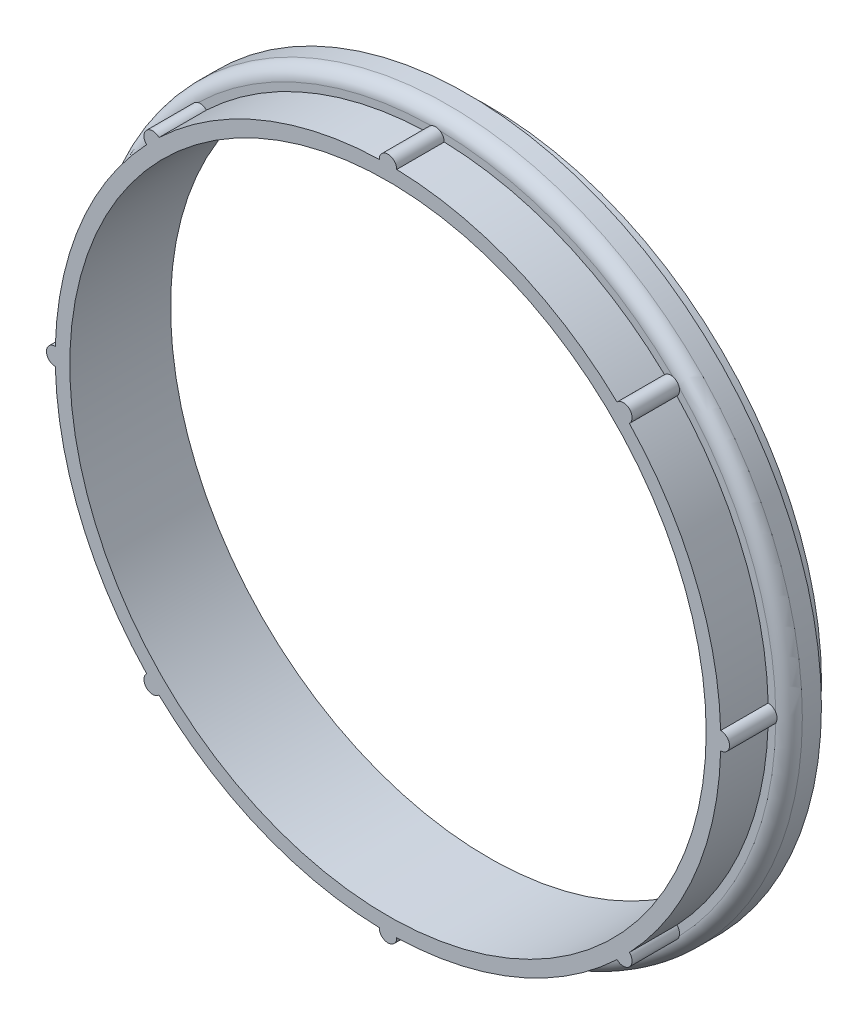
ISO-10303-21;
HEADER;
FILE_DESCRIPTION(('STEP AP214'),'2;1');
FILE_NAME('part.step','',(''),(''),'','','');
FILE_SCHEMA(('AUTOMOTIVE_DESIGN { 1 0 10303 214 1 1 1 1 }'));
ENDSEC;
DATA;
#1=APPLICATION_CONTEXT('core data for automotive mechanical design processes');
#2=APPLICATION_PROTOCOL_DEFINITION('international standard','automotive_design',2000,#1);
#3=PRODUCT_CONTEXT('',#1,'mechanical');
#4=PRODUCT('Part','Part','',(#3));
#5=PRODUCT_RELATED_PRODUCT_CATEGORY('part','',(#4));
#6=PRODUCT_DEFINITION_FORMATION('','',#4);
#7=PRODUCT_DEFINITION_CONTEXT('part definition',#1,'design');
#8=PRODUCT_DEFINITION('design','',#6,#7);
#9=PRODUCT_DEFINITION_SHAPE('','',#8);
#10=(LENGTH_UNIT() NAMED_UNIT(*) SI_UNIT(.MILLI.,.METRE.));
#11=(NAMED_UNIT(*) PLANE_ANGLE_UNIT() SI_UNIT($,.RADIAN.));
#12=(NAMED_UNIT(*) SI_UNIT($,.STERADIAN.) SOLID_ANGLE_UNIT());
#13=UNCERTAINTY_MEASURE_WITH_UNIT(LENGTH_MEASURE(1.E-05),#10,'distance_accuracy_value','');
#14=(GEOMETRIC_REPRESENTATION_CONTEXT(3) GLOBAL_UNCERTAINTY_ASSIGNED_CONTEXT((#13)) GLOBAL_UNIT_ASSIGNED_CONTEXT((#10,
#11,#12)) REPRESENTATION_CONTEXT('',''));
#15=CARTESIAN_POINT('',(0.,0.,0.));
#16=DIRECTION('',(0.,0.,1.));
#17=DIRECTION('',(1.,0.,0.));
#18=AXIS2_PLACEMENT_3D('',#15,#16,#17);
#19=CARTESIAN_POINT('',(0.,0.,0.41275));
#20=DIRECTION('',(0.,0.,1.));
#21=DIRECTION('',(1.,0.,0.));
#22=AXIS2_PLACEMENT_3D('',#19,#20,#21);
#23=PLANE('',#22);
#24=CARTESIAN_POINT('',(-33.8106642958257,-33.8106642958251,0.41275000000951));
#25=DIRECTION('',(0.,0.,1.));
#26=DIRECTION('',(1.,0.,0.));
#27=AXIS2_PLACEMENT_3D('',#24,#25,#26);
#28=CIRCLE('',#27,1.25628517150907);
#29=CARTESIAN_POINT('',(-35.0304086105332,-34.1114569800647,0.412745117402396));
#30=VERTEX_POINT('',#29);
#31=CARTESIAN_POINT('',(-34.6872456218226,-32.9107434042646,0.412750000009506));
#32=VERTEX_POINT('',#31);
#33=EDGE_CURVE('E396',#30,#32,#28,.F.);
#34=ORIENTED_EDGE('',*,*,#33,.T.);
#35=CARTESIAN_POINT('',(0.,0.,0.41275));
#36=DIRECTION('',(0.,0.,1.));
#37=DIRECTION('',(1.,0.,0.));
#38=AXIS2_PLACEMENT_3D('',#35,#36,#37);
#39=CIRCLE('',#38,47.8155);
#40=CARTESIAN_POINT('',(-47.7989964349201,-1.25617676482725,0.412750000009506));
#41=VERTEX_POINT('',#40);
#42=EDGE_CURVE('E287',#41,#32,#39,.T.);
#43=ORIENTED_EDGE('',*,*,#42,.F.);
#44=CARTESIAN_POINT('',(-47.8155,5.00840777872362E-13,0.41275000000951));
#45=DIRECTION('',(0.,0.,1.));
#46=DIRECTION('',(1.,0.,0.));
#47=AXIS2_PLACEMENT_3D('',#44,#45,#46);
#48=CIRCLE('',#47,1.25628517150907);
#49=CARTESIAN_POINT('',(-48.8906820258896,-0.649796924705635,0.412750000009724));
#50=VERTEX_POINT('',#49);
#51=EDGE_CURVE('E51',#41,#50,#48,.F.);
#52=ORIENTED_EDGE('',*,*,#51,.T.);
#53=CARTESIAN_POINT('',(0.,0.,0.41275));
#54=DIRECTION('',(0.,0.,1.));
#55=DIRECTION('',(1.,0.,0.));
#56=AXIS2_PLACEMENT_3D('',#53,#54,#55);
#57=CIRCLE('',#56,48.895);
#58=EDGE_CURVE('E210',#50,#30,#57,.T.);
#59=ORIENTED_EDGE('',*,*,#58,.T.);
#60=EDGE_LOOP('',(#34,#43,#52,#59));
#61=FACE_BOUND('',#60,.T.);
#62=ADVANCED_FACE('F34',(#61),#23,.T.);
#63=CARTESIAN_POINT('',(0.,-47.8155,0.41275000000951));
#64=DIRECTION('',(0.,0.,1.));
#65=DIRECTION('',(1.,0.,0.));
#66=AXIS2_PLACEMENT_3D('',#63,#64,#65);
#67=CIRCLE('',#66,1.25628517150907);
#68=CARTESIAN_POINT('',(-0.649796847023239,-48.890682072838,0.412745117292175));
#69=VERTEX_POINT('',#68);
#70=CARTESIAN_POINT('',(-1.25617676482775,-47.7989964349201,0.412750000009506));
#71=VERTEX_POINT('',#70);
#72=EDGE_CURVE('E378',#69,#71,#67,.F.);
#73=ORIENTED_EDGE('',*,*,#72,.T.);
#74=CARTESIAN_POINT('',(-32.9107434042653,-34.687245621822,0.412750000009506));
#75=VERTEX_POINT('',#74);
#76=EDGE_CURVE('E736',#75,#71,#39,.T.);
#77=ORIENTED_EDGE('',*,*,#76,.F.);
#78=CARTESIAN_POINT('',(-34.1114569800653,-35.0304086105326,0.412745117402396));
#79=VERTEX_POINT('',#78);
#80=EDGE_CURVE('E394',#75,#79,#28,.F.);
#81=ORIENTED_EDGE('',*,*,#80,.T.);
#82=EDGE_CURVE('E255',#79,#69,#57,.T.);
#83=ORIENTED_EDGE('',*,*,#82,.T.);
#84=EDGE_LOOP('',(#73,#77,#81,#83));
#85=FACE_BOUND('',#84,.T.);
#86=ADVANCED_FACE('F451',(#85),#23,.T.);
#87=CARTESIAN_POINT('',(33.8106642958252,-33.8106642958255,0.41275000000951));
#88=DIRECTION('',(0.,0.,1.));
#89=DIRECTION('',(1.,0.,0.));
#90=AXIS2_PLACEMENT_3D('',#87,#88,#89);
#91=CIRCLE('',#90,1.25628517150907);
#92=CARTESIAN_POINT('',(34.111457010975,-35.0304086029106,0.412745117365978));
#93=VERTEX_POINT('',#92);
#94=CARTESIAN_POINT('',(32.9107434042648,-34.6872456218225,0.412750000009506));
#95=VERTEX_POINT('',#94);
#96=EDGE_CURVE('E360',#93,#95,#91,.F.);
#97=ORIENTED_EDGE('',*,*,#96,.T.);
#98=CARTESIAN_POINT('',(1.25617676482775,-47.7989964349201,0.412750000009506));
#99=VERTEX_POINT('',#98);
#100=EDGE_CURVE('E735',#99,#95,#39,.T.);
#101=ORIENTED_EDGE('',*,*,#100,.F.);
#102=CARTESIAN_POINT('',(0.649796986562639,-48.890681988506,0.412745117478685));
#103=VERTEX_POINT('',#102);
#104=EDGE_CURVE('E376',#99,#103,#67,.F.);
#105=ORIENTED_EDGE('',*,*,#104,.T.);
#106=EDGE_CURVE('E253',#103,#93,#57,.T.);
#107=ORIENTED_EDGE('',*,*,#106,.T.);
#108=EDGE_LOOP('',(#97,#101,#105,#107));
#109=FACE_BOUND('',#108,.T.);
#110=ADVANCED_FACE('F458',(#109),#23,.T.);
#111=CARTESIAN_POINT('',(47.8155,-1.66946925957454E-13,0.41275000000951));
#112=DIRECTION('',(0.,0.,1.));
#113=DIRECTION('',(1.,0.,0.));
#114=AXIS2_PLACEMENT_3D('',#111,#112,#113);
#115=CIRCLE('',#114,1.25628517150907);
#116=CARTESIAN_POINT('',(48.8906820230005,-0.6497969294867,0.412745117402397));
#117=VERTEX_POINT('',#116);
#118=CARTESIAN_POINT('',(47.7989964349201,-1.25617676482791,0.412750000009506));
#119=VERTEX_POINT('',#118);
#120=EDGE_CURVE('E342',#117,#119,#115,.F.);
#121=ORIENTED_EDGE('',*,*,#120,.T.);
#122=CARTESIAN_POINT('',(34.6872456218221,-32.9107434042651,0.412750000009506));
#123=VERTEX_POINT('',#122);
#124=EDGE_CURVE('E298',#123,#119,#39,.T.);
#125=ORIENTED_EDGE('',*,*,#124,.F.);
#126=CARTESIAN_POINT('',(35.0304086227246,-34.1114569306262,0.412745117460644));
#127=VERTEX_POINT('',#126);
#128=EDGE_CURVE('E358',#123,#127,#91,.F.);
#129=ORIENTED_EDGE('',*,*,#128,.T.);
#130=EDGE_CURVE('E244',#127,#117,#57,.T.);
#131=ORIENTED_EDGE('',*,*,#130,.T.);
#132=EDGE_LOOP('',(#121,#125,#129,#131));
#133=FACE_BOUND('',#132,.T.);
#134=ADVANCED_FACE('F535',(#133),#23,.T.);
#135=CARTESIAN_POINT('',(33.8106642958254,33.8106642958253,0.41275000000951));
#136=DIRECTION('',(0.,0.,1.));
#137=DIRECTION('',(1.,0.,0.));
#138=AXIS2_PLACEMENT_3D('',#135,#136,#137);
#139=CIRCLE('',#138,1.25628517150907);
#140=CARTESIAN_POINT('',(35.0304086029105,34.1114570109751,0.412745117365978));
#141=VERTEX_POINT('',#140);
#142=CARTESIAN_POINT('',(34.6872456218224,32.9107434042649,0.412750000009506));
#143=VERTEX_POINT('',#142);
#144=EDGE_CURVE('E325',#141,#143,#139,.F.);
#145=ORIENTED_EDGE('',*,*,#144,.T.);
#146=CARTESIAN_POINT('',(47.7989964349201,1.25617676482758,0.412750000009506));
#147=VERTEX_POINT('',#146);
#148=EDGE_CURVE('E291',#147,#143,#39,.T.);
#149=ORIENTED_EDGE('',*,*,#148,.F.);
#150=CARTESIAN_POINT('',(48.8906820230007,0.649796929486129,0.412745117402396));
#151=VERTEX_POINT('',#150);
#152=EDGE_CURVE('E340',#147,#151,#115,.F.);
#153=ORIENTED_EDGE('',*,*,#152,.T.);
#154=EDGE_CURVE('E233',#151,#141,#57,.T.);
#155=ORIENTED_EDGE('',*,*,#154,.T.);
#156=EDGE_LOOP('',(#145,#149,#153,#155));
#157=FACE_BOUND('',#156,.T.);
#158=ADVANCED_FACE('F532',(#157),#23,.T.);
#159=CARTESIAN_POINT('',(0.,47.8155,0.41275000000951));
#160=DIRECTION('',(0.,0.,1.));
#161=DIRECTION('',(1.,0.,0.));
#162=AXIS2_PLACEMENT_3D('',#159,#160,#161);
#163=CIRCLE('',#162,1.25628517150907);
#164=CARTESIAN_POINT('',(0.649796923205036,48.8906820267968,0.412745117394001));
#165=VERTEX_POINT('',#164);
#166=CARTESIAN_POINT('',(1.25617676482775,47.7989964349201,0.412750000009506));
#167=VERTEX_POINT('',#166);
#168=EDGE_CURVE('E310',#165,#167,#163,.F.);
#169=ORIENTED_EDGE('',*,*,#168,.T.);
#170=CARTESIAN_POINT('',(32.910743404265,34.6872456218222,0.412750000009506));
#171=VERTEX_POINT('',#170);
#172=EDGE_CURVE('E283',#171,#167,#39,.T.);
#173=ORIENTED_EDGE('',*,*,#172,.F.);
#174=CARTESIAN_POINT('',(34.1114569306261,35.0304086227247,0.412745117460644));
#175=VERTEX_POINT('',#174);
#176=EDGE_CURVE('E323',#171,#175,#139,.F.);
#177=ORIENTED_EDGE('',*,*,#176,.T.);
#178=EDGE_CURVE('E231',#175,#165,#57,.T.);
#179=ORIENTED_EDGE('',*,*,#178,.T.);
#180=EDGE_LOOP('',(#169,#173,#177,#179));
#181=FACE_BOUND('',#180,.T.);
#182=ADVANCED_FACE('F534',(#181),#23,.T.);
#183=CARTESIAN_POINT('',(-33.8106642958249,33.8106642958258,0.41275000000951));
#184=DIRECTION('',(0.,0.,1.));
#185=DIRECTION('',(1.,0.,0.));
#186=AXIS2_PLACEMENT_3D('',#183,#184,#185);
#187=CIRCLE('',#186,1.25628517150907);
#188=CARTESIAN_POINT('',(-34.1114569800646,35.0304086105334,0.412745117402396));
#189=VERTEX_POINT('',#188);
#190=CARTESIAN_POINT('',(-32.9107434042645,34.6872456218227,0.412750000009506));
#191=VERTEX_POINT('',#190);
#192=EDGE_CURVE('E217',#189,#191,#187,.F.);
#193=ORIENTED_EDGE('',*,*,#192,.T.);
#194=CARTESIAN_POINT('',(-1.25617676482775,47.7989964349201,0.412750000009506));
#195=VERTEX_POINT('',#194);
#196=EDGE_CURVE('E278',#195,#191,#39,.T.);
#197=ORIENTED_EDGE('',*,*,#196,.F.);
#198=CARTESIAN_POINT('',(-0.649796958444113,48.8906820054997,0.412745117442093));
#199=VERTEX_POINT('',#198);
#200=EDGE_CURVE('E228',#195,#199,#163,.F.);
#201=ORIENTED_EDGE('',*,*,#200,.T.);
#202=EDGE_CURVE('E204',#199,#189,#57,.T.);
#203=ORIENTED_EDGE('',*,*,#202,.T.);
#204=EDGE_LOOP('',(#193,#197,#201,#203));
#205=FACE_BOUND('',#204,.T.);
#206=ADVANCED_FACE('F226',(#205),#23,.T.);
#207=CARTESIAN_POINT('',(-35.0304086105325,34.1114569800654,0.412745117402396));
#208=VERTEX_POINT('',#207);
#209=EDGE_CURVE('E211',#208,#189,#187,.F.);
#210=ORIENTED_EDGE('',*,*,#209,.T.);
#211=EDGE_CURVE('E200',#189,#208,#57,.T.);
#212=ORIENTED_EDGE('',*,*,#211,.T.);
#213=EDGE_LOOP('',(#210,#212));
#214=FACE_BOUND('',#213,.T.);
#215=ADVANCED_FACE('F213',(#214),#23,.F.);
#216=EDGE_CURVE('E309',#199,#165,#163,.F.);
#217=ORIENTED_EDGE('',*,*,#216,.T.);
#218=EDGE_CURVE('E229',#165,#199,#57,.T.);
#219=ORIENTED_EDGE('',*,*,#218,.T.);
#220=EDGE_LOOP('',(#217,#219));
#221=FACE_BOUND('',#220,.T.);
#222=ADVANCED_FACE('F527',(#221),#23,.F.);
#223=EDGE_CURVE('E324',#175,#141,#139,.F.);
#224=ORIENTED_EDGE('',*,*,#223,.T.);
#225=EDGE_CURVE('E230',#141,#175,#57,.T.);
#226=ORIENTED_EDGE('',*,*,#225,.T.);
#227=EDGE_LOOP('',(#224,#226));
#228=FACE_BOUND('',#227,.T.);
#229=ADVANCED_FACE('F528',(#228),#23,.F.);
#230=EDGE_CURVE('E341',#151,#117,#115,.F.);
#231=ORIENTED_EDGE('',*,*,#230,.T.);
#232=EDGE_CURVE('E238',#117,#151,#57,.T.);
#233=ORIENTED_EDGE('',*,*,#232,.T.);
#234=EDGE_LOOP('',(#231,#233));
#235=FACE_BOUND('',#234,.T.);
#236=ADVANCED_FACE('F674',(#235),#23,.F.);
#237=EDGE_CURVE('E359',#127,#93,#91,.F.);
#238=ORIENTED_EDGE('',*,*,#237,.T.);
#239=EDGE_CURVE('E239',#93,#127,#57,.T.);
#240=ORIENTED_EDGE('',*,*,#239,.T.);
#241=EDGE_LOOP('',(#238,#240));
#242=FACE_BOUND('',#241,.T.);
#243=ADVANCED_FACE('F667',(#242),#23,.F.);
#244=EDGE_CURVE('E377',#103,#69,#67,.F.);
#245=ORIENTED_EDGE('',*,*,#244,.T.);
#246=EDGE_CURVE('E249',#69,#103,#57,.T.);
#247=ORIENTED_EDGE('',*,*,#246,.T.);
#248=EDGE_LOOP('',(#245,#247));
#249=FACE_BOUND('',#248,.T.);
#250=ADVANCED_FACE('F481',(#249),#23,.F.);
#251=EDGE_CURVE('E395',#79,#30,#28,.F.);
#252=ORIENTED_EDGE('',*,*,#251,.T.);
#253=EDGE_CURVE('E260',#30,#79,#57,.T.);
#254=ORIENTED_EDGE('',*,*,#253,.T.);
#255=EDGE_LOOP('',(#252,#254));
#256=FACE_BOUND('',#255,.T.);
#257=ADVANCED_FACE('F475',(#256),#23,.F.);
#258=CARTESIAN_POINT('',(-48.8906820230006,0.649796929486813,0.412745117402396));
#259=VERTEX_POINT('',#258);
#260=EDGE_CURVE('E412',#50,#259,#48,.F.);
#261=ORIENTED_EDGE('',*,*,#260,.T.);
#262=EDGE_CURVE('E261',#259,#50,#57,.T.);
#263=ORIENTED_EDGE('',*,*,#262,.T.);
#264=EDGE_LOOP('',(#261,#263));
#265=FACE_BOUND('',#264,.T.);
#266=ADVANCED_FACE('F464',(#265),#23,.F.);
#267=CARTESIAN_POINT('',(0.,0.,7.239));
#268=DIRECTION('',(0.,0.,-1.));
#269=DIRECTION('',(-1.,0.,0.));
#270=AXIS2_PLACEMENT_3D('',#267,#268,#269);
#271=CYLINDRICAL_SURFACE('',#270,47.8155);
#272=ORIENTED_EDGE('',*,*,#196,.T.);
#273=DIRECTION('',(0.,0.,-1.));
#274=VECTOR('',#273,1.);
#275=CARTESIAN_POINT('',(-32.9107434042645,34.6872456218227,3.82587500000475));
#276=LINE('',#275,#274);
#277=CARTESIAN_POINT('',(-32.9107434042645,34.6872456218227,7.23900000002685));
#278=VERTEX_POINT('',#277);
#279=EDGE_CURVE('E222',#278,#191,#276,.T.);
#280=ORIENTED_EDGE('',*,*,#279,.F.);
#281=CARTESIAN_POINT('',(0.,0.,7.239));
#282=DIRECTION('',(0.,0.,1.));
#283=DIRECTION('',(1.,0.,0.));
#284=AXIS2_PLACEMENT_3D('',#281,#282,#283);
#285=CIRCLE('',#284,47.8155);
#286=CARTESIAN_POINT('',(-1.2561767648278,47.7989964349201,7.239));
#287=VERTEX_POINT('',#286);
#288=EDGE_CURVE('E43',#287,#278,#285,.T.);
#289=ORIENTED_EDGE('',*,*,#288,.F.);
#290=DIRECTION('',(0.,0.,-1.));
#291=VECTOR('',#290,1.);
#292=CARTESIAN_POINT('',(-1.2561767648278,47.7989964349201,3.825875));
#293=LINE('',#292,#291);
#294=EDGE_CURVE('E300',#195,#287,#293,.F.);
#295=ORIENTED_EDGE('',*,*,#294,.F.);
#296=EDGE_LOOP('',(#272,#280,#289,#295));
#297=FACE_BOUND('',#296,.T.);
#298=ADVANCED_FACE('F474',(#297),#271,.T.);
#299=CARTESIAN_POINT('',(-34.6872456218219,32.9107434042654,7.23900000002685));
#300=VERTEX_POINT('',#299);
#301=CARTESIAN_POINT('',(-47.7989964349201,1.25617676482825,7.23900000002685));
#302=VERTEX_POINT('',#301);
#303=EDGE_CURVE('E59',#300,#302,#285,.T.);
#304=ORIENTED_EDGE('',*,*,#303,.F.);
#305=DIRECTION('',(0.,0.,-1.));
#306=VECTOR('',#305,1.);
#307=CARTESIAN_POINT('',(-34.6872456218219,32.9107434042653,3.82587500000475));
#308=LINE('',#307,#306);
#309=CARTESIAN_POINT('',(-34.6872456218219,32.9107434042654,0.412750000009506));
#310=VERTEX_POINT('',#309);
#311=EDGE_CURVE('E419',#310,#300,#308,.F.);
#312=ORIENTED_EDGE('',*,*,#311,.F.);
#313=CARTESIAN_POINT('',(-47.7989964349201,1.25617676482825,0.412750000009506));
#314=VERTEX_POINT('',#313);
#315=EDGE_CURVE('E281',#310,#314,#39,.T.);
#316=ORIENTED_EDGE('',*,*,#315,.T.);
#317=DIRECTION('',(0.,0.,-1.));
#318=VECTOR('',#317,1.);
#319=CARTESIAN_POINT('',(-47.7989964349201,1.2561767648283,3.82587500000475));
#320=LINE('',#319,#318);
#321=EDGE_CURVE('E408',#302,#314,#320,.T.);
#322=ORIENTED_EDGE('',*,*,#321,.F.);
#323=EDGE_LOOP('',(#304,#312,#316,#322));
#324=FACE_BOUND('',#323,.T.);
#325=ADVANCED_FACE('F480',(#324),#271,.T.);
#326=CARTESIAN_POINT('',(-47.7989964349201,-1.25617676482725,7.23900000002685));
#327=VERTEX_POINT('',#326);
#328=CARTESIAN_POINT('',(-34.6872456218226,-32.9107434042646,7.23900000002685));
#329=VERTEX_POINT('',#328);
#330=EDGE_CURVE('E498',#327,#329,#285,.T.);
#331=ORIENTED_EDGE('',*,*,#330,.F.);
#332=DIRECTION('',(0.,0.,-1.));
#333=VECTOR('',#332,1.);
#334=CARTESIAN_POINT('',(-47.7989964349201,-1.2561767648273,3.82587500000475));
#335=LINE('',#334,#333);
#336=EDGE_CURVE('E404',#41,#327,#335,.F.);
#337=ORIENTED_EDGE('',*,*,#336,.F.);
#338=ORIENTED_EDGE('',*,*,#42,.T.);
#339=DIRECTION('',(0.,0.,-1.));
#340=VECTOR('',#339,1.);
#341=CARTESIAN_POINT('',(-34.6872456218226,-32.9107434042646,3.82587500000475));
#342=LINE('',#341,#340);
#343=EDGE_CURVE('E390',#329,#32,#342,.T.);
#344=ORIENTED_EDGE('',*,*,#343,.F.);
#345=EDGE_LOOP('',(#331,#337,#338,#344));
#346=FACE_BOUND('',#345,.T.);
#347=ADVANCED_FACE('F485',(#346),#271,.T.);
#348=CARTESIAN_POINT('',(-32.9107434042653,-34.687245621822,7.23900000002685));
#349=VERTEX_POINT('',#348);
#350=CARTESIAN_POINT('',(-1.25617676482775,-47.7989964349201,7.23900000002685));
#351=VERTEX_POINT('',#350);
#352=EDGE_CURVE('E499',#349,#351,#285,.T.);
#353=ORIENTED_EDGE('',*,*,#352,.F.);
#354=DIRECTION('',(0.,0.,-1.));
#355=VECTOR('',#354,1.);
#356=CARTESIAN_POINT('',(-32.9107434042652,-34.6872456218221,3.82587500000475));
#357=LINE('',#356,#355);
#358=EDGE_CURVE('E386',#75,#349,#357,.F.);
#359=ORIENTED_EDGE('',*,*,#358,.F.);
#360=ORIENTED_EDGE('',*,*,#76,.T.);
#361=DIRECTION('',(0.,0.,-1.));
#362=VECTOR('',#361,1.);
#363=CARTESIAN_POINT('',(-1.2561767648278,-47.7989964349201,3.82587500000475));
#364=LINE('',#363,#362);
#365=EDGE_CURVE('E372',#351,#71,#364,.T.);
#366=ORIENTED_EDGE('',*,*,#365,.F.);
#367=EDGE_LOOP('',(#353,#359,#360,#366));
#368=FACE_BOUND('',#367,.T.);
#369=ADVANCED_FACE('F489',(#368),#271,.T.);
#370=CARTESIAN_POINT('',(1.25617676482775,-47.7989964349201,7.23900000002685));
#371=VERTEX_POINT('',#370);
#372=CARTESIAN_POINT('',(32.9107434042648,-34.6872456218225,7.23900000002685));
#373=VERTEX_POINT('',#372);
#374=EDGE_CURVE('E501',#371,#373,#285,.T.);
#375=ORIENTED_EDGE('',*,*,#374,.F.);
#376=DIRECTION('',(0.,0.,-1.));
#377=VECTOR('',#376,1.);
#378=CARTESIAN_POINT('',(1.2561767648278,-47.7989964349201,3.82587500000475));
#379=LINE('',#378,#377);
#380=EDGE_CURVE('E368',#99,#371,#379,.F.);
#381=ORIENTED_EDGE('',*,*,#380,.F.);
#382=ORIENTED_EDGE('',*,*,#100,.T.);
#383=DIRECTION('',(0.,0.,-1.));
#384=VECTOR('',#383,1.);
#385=CARTESIAN_POINT('',(32.9107434042647,-34.6872456218225,3.82587500000475));
#386=LINE('',#385,#384);
#387=EDGE_CURVE('E354',#373,#95,#386,.T.);
#388=ORIENTED_EDGE('',*,*,#387,.F.);
#389=EDGE_LOOP('',(#375,#381,#382,#388));
#390=FACE_BOUND('',#389,.T.);
#391=ADVANCED_FACE('F494',(#390),#271,.T.);
#392=CARTESIAN_POINT('',(34.6872456218221,-32.9107434042651,7.23900000002685));
#393=VERTEX_POINT('',#392);
#394=CARTESIAN_POINT('',(47.7989964349201,-1.25617676482791,7.23900000002685));
#395=VERTEX_POINT('',#394);
#396=EDGE_CURVE('E734',#393,#395,#285,.T.);
#397=ORIENTED_EDGE('',*,*,#396,.F.);
#398=DIRECTION('',(0.,0.,-1.));
#399=VECTOR('',#398,1.);
#400=CARTESIAN_POINT('',(34.6872456218222,-32.9107434042651,3.82587500000475));
#401=LINE('',#400,#399);
#402=EDGE_CURVE('E350',#123,#393,#401,.F.);
#403=ORIENTED_EDGE('',*,*,#402,.F.);
#404=ORIENTED_EDGE('',*,*,#124,.T.);
#405=DIRECTION('',(0.,0.,-1.));
#406=VECTOR('',#405,1.);
#407=CARTESIAN_POINT('',(47.7989964349201,-1.25617676482797,3.82587500000475));
#408=LINE('',#407,#406);
#409=EDGE_CURVE('E336',#395,#119,#408,.T.);
#410=ORIENTED_EDGE('',*,*,#409,.F.);
#411=EDGE_LOOP('',(#397,#403,#404,#410));
#412=FACE_BOUND('',#411,.T.);
#413=ADVANCED_FACE('F732',(#412),#271,.T.);
#414=CARTESIAN_POINT('',(47.7989964349201,1.25617676482758,7.23900000002685));
#415=VERTEX_POINT('',#414);
#416=CARTESIAN_POINT('',(34.6872456218224,32.9107434042648,7.239));
#417=VERTEX_POINT('',#416);
#418=EDGE_CURVE('E508',#415,#417,#285,.T.);
#419=ORIENTED_EDGE('',*,*,#418,.F.);
#420=DIRECTION('',(0.,0.,-1.));
#421=VECTOR('',#420,1.);
#422=CARTESIAN_POINT('',(47.7989964349201,1.25617676482763,3.82587500000475));
#423=LINE('',#422,#421);
#424=EDGE_CURVE('E332',#147,#415,#423,.F.);
#425=ORIENTED_EDGE('',*,*,#424,.F.);
#426=ORIENTED_EDGE('',*,*,#148,.T.);
#427=DIRECTION('',(0.,0.,-1.));
#428=VECTOR('',#427,1.);
#429=CARTESIAN_POINT('',(34.6872456218224,32.9107434042648,3.82587500000475));
#430=LINE('',#429,#428);
#431=EDGE_CURVE('E319',#417,#143,#430,.T.);
#432=ORIENTED_EDGE('',*,*,#431,.F.);
#433=EDGE_LOOP('',(#419,#425,#426,#432));
#434=FACE_BOUND('',#433,.T.);
#435=ADVANCED_FACE('F523',(#434),#271,.T.);
#436=CARTESIAN_POINT('',(0.,0.,-7.239));
#437=DIRECTION('',(0.,0.,1.));
#438=DIRECTION('',(1.,0.,0.));
#439=AXIS2_PLACEMENT_3D('',#436,#437,#438);
#440=CIRCLE('',#439,47.8155);
#441=CARTESIAN_POINT('',(47.8155,0.,-7.239));
#442=VERTEX_POINT('',#441);
#443=EDGE_CURVE('E504',#442,#442,#440,.T.);
#444=ORIENTED_EDGE('',*,*,#443,.T.);
#445=EDGE_LOOP('',(#444));
#446=FACE_BOUND('',#445,.T.);
#447=CARTESIAN_POINT('',(0.,0.,-0.41275));
#448=DIRECTION('',(0.,0.,1.));
#449=DIRECTION('',(1.,0.,0.));
#450=AXIS2_PLACEMENT_3D('',#447,#448,#449);
#451=CIRCLE('',#450,47.8155);
#452=CARTESIAN_POINT('',(47.8155,0.,-0.41275));
#453=VERTEX_POINT('',#452);
#454=EDGE_CURVE('E12',#453,#453,#451,.T.);
#455=ORIENTED_EDGE('',*,*,#454,.F.);
#456=EDGE_LOOP('',(#455));
#457=FACE_BOUND('',#456,.T.);
#458=ADVANCED_FACE('F516',(#446,#457),#271,.T.);
#459=CARTESIAN_POINT('',(0.,0.,7.239));
#460=DIRECTION('',(0.,0.,1.));
#461=DIRECTION('',(1.,0.,0.));
#462=AXIS2_PLACEMENT_3D('',#459,#460,#461);
#463=PLANE('',#462);
#464=ORIENTED_EDGE('',*,*,#288,.T.);
#465=CARTESIAN_POINT('',(-33.8106642958249,33.8106642958258,7.239));
#466=DIRECTION('',(0.,0.,1.));
#467=DIRECTION('',(0.707106781186556,0.707106781186539,0.));
#468=AXIS2_PLACEMENT_3D('',#465,#466,#467);
#469=CIRCLE('',#468,1.25628517150907);
#470=EDGE_CURVE('E415',#278,#300,#469,.T.);
#471=ORIENTED_EDGE('',*,*,#470,.T.);
#472=ORIENTED_EDGE('',*,*,#303,.T.);
#473=CARTESIAN_POINT('',(-47.8155,5.00840777872362E-13,7.239));
#474=DIRECTION('',(0.,0.,1.));
#475=DIRECTION('',(0.,1.,0.));
#476=AXIS2_PLACEMENT_3D('',#473,#474,#475);
#477=CIRCLE('',#476,1.25628517150907);
#478=EDGE_CURVE('E400',#302,#327,#477,.T.);
#479=ORIENTED_EDGE('',*,*,#478,.T.);
#480=ORIENTED_EDGE('',*,*,#330,.T.);
#481=CARTESIAN_POINT('',(-33.8106642958257,-33.8106642958251,7.239));
#482=DIRECTION('',(0.,0.,1.));
#483=DIRECTION('',(-0.707106781186541,0.707106781186554,0.));
#484=AXIS2_PLACEMENT_3D('',#481,#482,#483);
#485=CIRCLE('',#484,1.25628517150907);
#486=EDGE_CURVE('E381',#329,#349,#485,.T.);
#487=ORIENTED_EDGE('',*,*,#486,.T.);
#488=ORIENTED_EDGE('',*,*,#352,.T.);
#489=CARTESIAN_POINT('',(0.,-47.8155,7.239));
#490=DIRECTION('',(0.,0.,1.));
#491=DIRECTION('',(-1.,0.,0.));
#492=AXIS2_PLACEMENT_3D('',#489,#490,#491);
#493=CIRCLE('',#492,1.25628517150907);
#494=EDGE_CURVE('E364',#351,#371,#493,.T.);
#495=ORIENTED_EDGE('',*,*,#494,.T.);
#496=ORIENTED_EDGE('',*,*,#374,.T.);
#497=CARTESIAN_POINT('',(33.8106642958252,-33.8106642958255,7.239));
#498=DIRECTION('',(0.,0.,1.));
#499=DIRECTION('',(-0.707106781186551,-0.707106781186544,0.));
#500=AXIS2_PLACEMENT_3D('',#497,#498,#499);
#501=CIRCLE('',#500,1.25628517150907);
#502=EDGE_CURVE('E346',#373,#393,#501,.T.);
#503=ORIENTED_EDGE('',*,*,#502,.T.);
#504=ORIENTED_EDGE('',*,*,#396,.T.);
#505=CARTESIAN_POINT('',(47.8155,-1.66946925957454E-13,7.239));
#506=DIRECTION('',(0.,0.,1.));
#507=DIRECTION('',(0.,-1.,0.));
#508=AXIS2_PLACEMENT_3D('',#505,#506,#507);
#509=CIRCLE('',#508,1.25628517150907);
#510=EDGE_CURVE('E328',#395,#415,#509,.T.);
#511=ORIENTED_EDGE('',*,*,#510,.T.);
#512=ORIENTED_EDGE('',*,*,#418,.T.);
#513=CARTESIAN_POINT('',(33.8106642958254,33.8106642958253,7.239));
#514=DIRECTION('',(0.,0.,1.));
#515=DIRECTION('',(0.707106781186546,-0.707106781186549,0.));
#516=AXIS2_PLACEMENT_3D('',#513,#514,#515);
#517=CIRCLE('',#516,1.25628517150907);
#518=CARTESIAN_POINT('',(32.910743404265,34.6872456218223,7.239));
#519=VERTEX_POINT('',#518);
#520=EDGE_CURVE('E312',#417,#519,#517,.T.);
#521=ORIENTED_EDGE('',*,*,#520,.T.);
#522=CARTESIAN_POINT('',(1.2561767648278,47.7989964349201,7.239));
#523=VERTEX_POINT('',#522);
#524=EDGE_CURVE('E503',#519,#523,#285,.T.);
#525=ORIENTED_EDGE('',*,*,#524,.T.);
#526=CARTESIAN_POINT('',(0.,47.8155,7.239));
#527=DIRECTION('',(0.,0.,1.));
#528=DIRECTION('',(1.,0.,0.));
#529=AXIS2_PLACEMENT_3D('',#526,#527,#528);
#530=CIRCLE('',#529,1.25628517150907);
#531=EDGE_CURVE('E292',#523,#287,#530,.T.);
#532=ORIENTED_EDGE('',*,*,#531,.T.);
#533=EDGE_LOOP('',(#464,#471,#472,#479,#480,#487,#488,#495,#496,#503,#504,#511,#512,#521,#525,#532));
#534=FACE_BOUND('',#533,.T.);
#535=CARTESIAN_POINT('',(0.,0.,7.239));
#536=DIRECTION('',(0.,0.,1.));
#537=DIRECTION('',(1.,0.,0.));
#538=AXIS2_PLACEMENT_3D('',#535,#536,#537);
#539=CIRCLE('',#538,45.72);
#540=CARTESIAN_POINT('',(45.72,0.,7.239));
#541=VERTEX_POINT('',#540);
#542=EDGE_CURVE('E271',#541,#541,#539,.T.);
#543=ORIENTED_EDGE('',*,*,#542,.F.);
#544=EDGE_LOOP('',(#543));
#545=FACE_BOUND('',#544,.T.);
#546=ADVANCED_FACE('F513',(#534,#545),#463,.T.);
#547=CARTESIAN_POINT('',(0.,0.,-7.239));
#548=DIRECTION('',(0.,0.,1.));
#549=DIRECTION('',(1.,0.,0.));
#550=AXIS2_PLACEMENT_3D('',#547,#548,#549);
#551=PLANE('',#550);
#552=ORIENTED_EDGE('',*,*,#443,.F.);
#553=EDGE_LOOP('',(#552));
#554=FACE_BOUND('',#553,.T.);
#555=CARTESIAN_POINT('',(0.,0.,-7.239));
#556=DIRECTION('',(0.,0.,1.));
#557=DIRECTION('',(1.,0.,0.));
#558=AXIS2_PLACEMENT_3D('',#555,#556,#557);
#559=CIRCLE('',#558,45.72);
#560=CARTESIAN_POINT('',(45.72,0.,-7.239));
#561=VERTEX_POINT('',#560);
#562=EDGE_CURVE('E269',#561,#561,#559,.T.);
#563=ORIENTED_EDGE('',*,*,#562,.T.);
#564=EDGE_LOOP('',(#563));
#565=FACE_BOUND('',#564,.T.);
#566=ADVANCED_FACE('F515',(#554,#565),#551,.F.);
#567=ORIENTED_EDGE('',*,*,#524,.F.);
#568=DIRECTION('',(0.,0.,-1.));
#569=VECTOR('',#568,1.);
#570=CARTESIAN_POINT('',(32.910743404265,34.6872456218223,3.82587500000475));
#571=LINE('',#570,#569);
#572=EDGE_CURVE('E315',#171,#519,#571,.F.);
#573=ORIENTED_EDGE('',*,*,#572,.F.);
#574=ORIENTED_EDGE('',*,*,#172,.T.);
#575=DIRECTION('',(0.,0.,-1.));
#576=VECTOR('',#575,1.);
#577=CARTESIAN_POINT('',(1.2561767648278,47.7989964349201,3.825875));
#578=LINE('',#577,#576);
#579=EDGE_CURVE('E306',#523,#167,#578,.T.);
#580=ORIENTED_EDGE('',*,*,#579,.F.);
#581=EDGE_LOOP('',(#567,#573,#574,#580));
#582=FACE_BOUND('',#581,.T.);
#583=ADVANCED_FACE('F36',(#582),#271,.T.);
#584=CARTESIAN_POINT('',(0.,0.,7.239));
#585=DIRECTION('',(0.,0.,-1.));
#586=DIRECTION('',(-1.,0.,0.));
#587=AXIS2_PLACEMENT_3D('',#584,#585,#586);
#588=CYLINDRICAL_SURFACE('',#587,45.72);
#589=ORIENTED_EDGE('',*,*,#542,.T.);
#590=EDGE_LOOP('',(#589));
#591=FACE_BOUND('',#590,.T.);
#592=ORIENTED_EDGE('',*,*,#562,.F.);
#593=EDGE_LOOP('',(#592));
#594=FACE_BOUND('',#593,.T.);
#595=ADVANCED_FACE('F463',(#591,#594),#588,.F.);
#596=EDGE_CURVE('E413',#259,#314,#48,.F.);
#597=ORIENTED_EDGE('',*,*,#596,.T.);
#598=ORIENTED_EDGE('',*,*,#315,.F.);
#599=EDGE_CURVE('E216',#310,#208,#187,.F.);
#600=ORIENTED_EDGE('',*,*,#599,.T.);
#601=EDGE_CURVE('E207',#208,#259,#57,.T.);
#602=ORIENTED_EDGE('',*,*,#601,.T.);
#603=EDGE_LOOP('',(#597,#598,#600,#602));
#604=FACE_BOUND('',#603,.T.);
#605=ADVANCED_FACE('F453',(#604),#23,.T.);
#606=CARTESIAN_POINT('',(0.,0.,-0.41275));
#607=DIRECTION('',(0.,0.,1.));
#608=DIRECTION('',(1.,0.,0.));
#609=AXIS2_PLACEMENT_3D('',#606,#607,#608);
#610=PLANE('',#609);
#611=CARTESIAN_POINT('',(0.,0.,-0.41275));
#612=DIRECTION('',(0.,0.,1.));
#613=DIRECTION('',(1.,0.,0.));
#614=AXIS2_PLACEMENT_3D('',#611,#612,#613);
#615=CIRCLE('',#614,48.895);
#616=CARTESIAN_POINT('',(48.895,0.,-0.41275));
#617=VERTEX_POINT('',#616);
#618=EDGE_CURVE('E38',#617,#617,#615,.T.);
#619=ORIENTED_EDGE('',*,*,#618,.F.);
#620=EDGE_LOOP('',(#619));
#621=FACE_BOUND('',#620,.T.);
#622=ORIENTED_EDGE('',*,*,#454,.T.);
#623=EDGE_LOOP('',(#622));
#624=FACE_BOUND('',#623,.T.);
#625=ADVANCED_FACE('F462',(#621,#624),#610,.F.);
#626=CARTESIAN_POINT('',(0.,47.8155,-500000.));
#627=DIRECTION('',(0.,0.,1.));
#628=DIRECTION('',(1.,0.,0.));
#629=AXIS2_PLACEMENT_3D('',#626,#627,#628);
#630=CYLINDRICAL_SURFACE('',#629,1.25628517150907);
#631=ORIENTED_EDGE('',*,*,#531,.F.);
#632=ORIENTED_EDGE('',*,*,#579,.T.);
#633=ORIENTED_EDGE('',*,*,#168,.F.);
#634=ORIENTED_EDGE('',*,*,#216,.F.);
#635=ORIENTED_EDGE('',*,*,#200,.F.);
#636=ORIENTED_EDGE('',*,*,#294,.T.);
#637=EDGE_LOOP('',(#631,#632,#633,#634,#635,#636));
#638=FACE_BOUND('',#637,.T.);
#639=ADVANCED_FACE('F469',(#638),#630,.T.);
#640=CARTESIAN_POINT('',(33.8106642958254,33.8106642958253,-500000.));
#641=DIRECTION('',(0.,0.,1.));
#642=DIRECTION('',(1.,0.,0.));
#643=AXIS2_PLACEMENT_3D('',#640,#641,#642);
#644=CYLINDRICAL_SURFACE('',#643,1.25628517150907);
#645=ORIENTED_EDGE('',*,*,#520,.F.);
#646=ORIENTED_EDGE('',*,*,#431,.T.);
#647=ORIENTED_EDGE('',*,*,#144,.F.);
#648=ORIENTED_EDGE('',*,*,#223,.F.);
#649=ORIENTED_EDGE('',*,*,#176,.F.);
#650=ORIENTED_EDGE('',*,*,#572,.T.);
#651=EDGE_LOOP('',(#645,#646,#647,#648,#649,#650));
#652=FACE_BOUND('',#651,.T.);
#653=ADVANCED_FACE('F530',(#652),#644,.T.);
#654=CARTESIAN_POINT('',(47.8155,-1.66946925957454E-13,-500000.));
#655=DIRECTION('',(0.,0.,1.));
#656=DIRECTION('',(1.,0.,0.));
#657=AXIS2_PLACEMENT_3D('',#654,#655,#656);
#658=CYLINDRICAL_SURFACE('',#657,1.25628517150907);
#659=ORIENTED_EDGE('',*,*,#510,.F.);
#660=ORIENTED_EDGE('',*,*,#409,.T.);
#661=ORIENTED_EDGE('',*,*,#120,.F.);
#662=ORIENTED_EDGE('',*,*,#230,.F.);
#663=ORIENTED_EDGE('',*,*,#152,.F.);
#664=ORIENTED_EDGE('',*,*,#424,.T.);
#665=EDGE_LOOP('',(#659,#660,#661,#662,#663,#664));
#666=FACE_BOUND('',#665,.T.);
#667=ADVANCED_FACE('F610',(#666),#658,.T.);
#668=CARTESIAN_POINT('',(33.8106642958252,-33.8106642958255,-500000.));
#669=DIRECTION('',(0.,0.,1.));
#670=DIRECTION('',(1.,0.,0.));
#671=AXIS2_PLACEMENT_3D('',#668,#669,#670);
#672=CYLINDRICAL_SURFACE('',#671,1.25628517150907);
#673=ORIENTED_EDGE('',*,*,#502,.F.);
#674=ORIENTED_EDGE('',*,*,#387,.T.);
#675=ORIENTED_EDGE('',*,*,#96,.F.);
#676=ORIENTED_EDGE('',*,*,#237,.F.);
#677=ORIENTED_EDGE('',*,*,#128,.F.);
#678=ORIENTED_EDGE('',*,*,#402,.T.);
#679=EDGE_LOOP('',(#673,#674,#675,#676,#677,#678));
#680=FACE_BOUND('',#679,.T.);
#681=ADVANCED_FACE('F606',(#680),#672,.T.);
#682=CARTESIAN_POINT('',(0.,-47.8155,-500000.));
#683=DIRECTION('',(0.,0.,1.));
#684=DIRECTION('',(1.,0.,0.));
#685=AXIS2_PLACEMENT_3D('',#682,#683,#684);
#686=CYLINDRICAL_SURFACE('',#685,1.25628517150907);
#687=ORIENTED_EDGE('',*,*,#494,.F.);
#688=ORIENTED_EDGE('',*,*,#365,.T.);
#689=ORIENTED_EDGE('',*,*,#72,.F.);
#690=ORIENTED_EDGE('',*,*,#244,.F.);
#691=ORIENTED_EDGE('',*,*,#104,.F.);
#692=ORIENTED_EDGE('',*,*,#380,.T.);
#693=EDGE_LOOP('',(#687,#688,#689,#690,#691,#692));
#694=FACE_BOUND('',#693,.T.);
#695=ADVANCED_FACE('F602',(#694),#686,.T.);
#696=CARTESIAN_POINT('',(-33.8106642958257,-33.8106642958251,-500000.));
#697=DIRECTION('',(0.,0.,1.));
#698=DIRECTION('',(1.,0.,0.));
#699=AXIS2_PLACEMENT_3D('',#696,#697,#698);
#700=CYLINDRICAL_SURFACE('',#699,1.25628517150907);
#701=ORIENTED_EDGE('',*,*,#486,.F.);
#702=ORIENTED_EDGE('',*,*,#343,.T.);
#703=ORIENTED_EDGE('',*,*,#33,.F.);
#704=ORIENTED_EDGE('',*,*,#251,.F.);
#705=ORIENTED_EDGE('',*,*,#80,.F.);
#706=ORIENTED_EDGE('',*,*,#358,.T.);
#707=EDGE_LOOP('',(#701,#702,#703,#704,#705,#706));
#708=FACE_BOUND('',#707,.T.);
#709=ADVANCED_FACE('F599',(#708),#700,.T.);
#710=CARTESIAN_POINT('',(-47.8155,5.00840777872362E-13,-500000.));
#711=DIRECTION('',(0.,0.,1.));
#712=DIRECTION('',(1.,0.,0.));
#713=AXIS2_PLACEMENT_3D('',#710,#711,#712);
#714=CYLINDRICAL_SURFACE('',#713,1.25628517150907);
#715=ORIENTED_EDGE('',*,*,#478,.F.);
#716=ORIENTED_EDGE('',*,*,#321,.T.);
#717=ORIENTED_EDGE('',*,*,#596,.F.);
#718=ORIENTED_EDGE('',*,*,#260,.F.);
#719=ORIENTED_EDGE('',*,*,#51,.F.);
#720=ORIENTED_EDGE('',*,*,#336,.T.);
#721=EDGE_LOOP('',(#715,#716,#717,#718,#719,#720));
#722=FACE_BOUND('',#721,.T.);
#723=ADVANCED_FACE('F483',(#722),#714,.T.);
#724=CARTESIAN_POINT('',(-33.8106642958249,33.8106642958258,-500000.));
#725=DIRECTION('',(0.,0.,1.));
#726=DIRECTION('',(1.,0.,0.));
#727=AXIS2_PLACEMENT_3D('',#724,#725,#726);
#728=CYLINDRICAL_SURFACE('',#727,1.25628517150907);
#729=ORIENTED_EDGE('',*,*,#470,.F.);
#730=ORIENTED_EDGE('',*,*,#279,.T.);
#731=ORIENTED_EDGE('',*,*,#192,.F.);
#732=ORIENTED_EDGE('',*,*,#209,.F.);
#733=ORIENTED_EDGE('',*,*,#599,.F.);
#734=ORIENTED_EDGE('',*,*,#311,.T.);
#735=EDGE_LOOP('',(#729,#730,#731,#732,#733,#734));
#736=FACE_BOUND('',#735,.T.);
#737=ADVANCED_FACE('F221',(#736),#728,.T.);
#738=CARTESIAN_POINT('',(0.,0.,-1.49656797409099));
#739=DIRECTION('',(0.,0.,-1.));
#740=DIRECTION('',(-1.,0.,0.));
#741=AXIS2_PLACEMENT_3D('',#738,#739,#740);
#742=TOROIDAL_SURFACE('',#741,48.8906820258993,1.08381797410071);
#743=CARTESIAN_POINT('',(0.,0.,-1.4965679741007));
#744=DIRECTION('',(0.,0.,-1.));
#745=DIRECTION('',(-1.,0.,0.));
#746=AXIS2_PLACEMENT_3D('',#743,#744,#745);
#747=CIRCLE('',#746,49.9745);
#748=CARTESIAN_POINT('',(-49.9745,0.,-1.4965679741007));
#749=VERTEX_POINT('',#748);
#750=EDGE_CURVE('E432',#749,#749,#747,.T.);
#751=ORIENTED_EDGE('',*,*,#750,.T.);
#752=EDGE_LOOP('',(#751));
#753=FACE_BOUND('',#752,.T.);
#754=ORIENTED_EDGE('',*,*,#618,.T.);
#755=EDGE_LOOP('',(#754));
#756=FACE_BOUND('',#755,.T.);
#757=ADVANCED_FACE('F436',(#753,#756),#742,.F.);
#758=CARTESIAN_POINT('',(0.,0.,-1.4965679741007));
#759=DIRECTION('',(0.,0.,-1.));
#760=DIRECTION('',(-1.,0.,0.));
#761=AXIS2_PLACEMENT_3D('',#758,#759,#760);
#762=TOROIDAL_SURFACE('',#761,48.8906820258896,1.90931797411042);
#763=CARTESIAN_POINT('',(0.,0.,-1.4965679741007));
#764=DIRECTION('',(0.,0.,-1.));
#765=DIRECTION('',(-1.,0.,0.));
#766=AXIS2_PLACEMENT_3D('',#763,#764,#765);
#767=CIRCLE('',#766,50.8);
#768=CARTESIAN_POINT('',(-50.8,0.,-1.4965679741007));
#769=VERTEX_POINT('',#768);
#770=EDGE_CURVE('E225',#769,#769,#767,.T.);
#771=ORIENTED_EDGE('',*,*,#770,.F.);
#772=EDGE_LOOP('',(#771));
#773=FACE_BOUND('',#772,.T.);
#774=ORIENTED_EDGE('',*,*,#58,.F.);
#775=ORIENTED_EDGE('',*,*,#262,.F.);
#776=ORIENTED_EDGE('',*,*,#601,.F.);
#777=ORIENTED_EDGE('',*,*,#211,.F.);
#778=ORIENTED_EDGE('',*,*,#202,.F.);
#779=ORIENTED_EDGE('',*,*,#218,.F.);
#780=ORIENTED_EDGE('',*,*,#178,.F.);
#781=ORIENTED_EDGE('',*,*,#225,.F.);
#782=ORIENTED_EDGE('',*,*,#154,.F.);
#783=ORIENTED_EDGE('',*,*,#232,.F.);
#784=ORIENTED_EDGE('',*,*,#130,.F.);
#785=ORIENTED_EDGE('',*,*,#239,.F.);
#786=ORIENTED_EDGE('',*,*,#106,.F.);
#787=ORIENTED_EDGE('',*,*,#246,.F.);
#788=ORIENTED_EDGE('',*,*,#82,.F.);
#789=ORIENTED_EDGE('',*,*,#253,.F.);
#790=EDGE_LOOP('',(#774,#775,#776,#777,#778,#779,#780,#781,#782,#783,#784,#785,#786,#787,#788,#789));
#791=FACE_BOUND('',#790,.T.);
#792=ADVANCED_FACE('F202',(#773,#791),#762,.T.);
#793=CARTESIAN_POINT('',(0.,0.,-29.7405137208998));
#794=DIRECTION('',(0.,0.,-1.));
#795=DIRECTION('',(-1.,0.,0.));
#796=AXIS2_PLACEMENT_3D('',#793,#794,#795);
#797=CYLINDRICAL_SURFACE('',#796,50.8);
#798=ORIENTED_EDGE('',*,*,#770,.T.);
#799=EDGE_LOOP('',(#798));
#800=FACE_BOUND('',#799,.T.);
#801=CARTESIAN_POINT('',(0.,0.,-4.240158679394));
#802=DIRECTION('',(0.,0.,-1.));
#803=DIRECTION('',(-1.,0.,0.));
#804=AXIS2_PLACEMENT_3D('',#801,#802,#803);
#805=CIRCLE('',#804,50.8);
#806=CARTESIAN_POINT('',(-50.8,0.,-4.240158679394));
#807=VERTEX_POINT('',#806);
#808=EDGE_CURVE('E426',#807,#807,#805,.T.);
#809=ORIENTED_EDGE('',*,*,#808,.F.);
#810=EDGE_LOOP('',(#809));
#811=FACE_BOUND('',#810,.T.);
#812=ADVANCED_FACE('F446',(#800,#811),#797,.T.);
#813=CARTESIAN_POINT('',(0.,49.9745,-4.240158679394));
#814=DIRECTION('',(0.,0.,-1.));
#815=DIRECTION('',(-1.,0.,0.));
#816=AXIS2_PLACEMENT_3D('',#813,#814,#815);
#817=PLANE('',#816);
#818=ORIENTED_EDGE('',*,*,#808,.T.);
#819=EDGE_LOOP('',(#818));
#820=FACE_BOUND('',#819,.T.);
#821=CARTESIAN_POINT('',(0.,0.,-4.240158679394));
#822=DIRECTION('',(0.,0.,-1.));
#823=DIRECTION('',(-1.,0.,0.));
#824=AXIS2_PLACEMENT_3D('',#821,#822,#823);
#825=CIRCLE('',#824,49.9745);
#826=CARTESIAN_POINT('',(-49.9745,0.,-4.240158679394));
#827=VERTEX_POINT('',#826);
#828=EDGE_CURVE('E429',#827,#827,#825,.T.);
#829=ORIENTED_EDGE('',*,*,#828,.F.);
#830=EDGE_LOOP('',(#829));
#831=FACE_BOUND('',#830,.T.);
#832=ADVANCED_FACE('F440',(#820,#831),#817,.T.);
#833=CARTESIAN_POINT('',(0.,0.,-29.7405137208998));
#834=DIRECTION('',(0.,0.,-1.));
#835=DIRECTION('',(-1.,0.,0.));
#836=AXIS2_PLACEMENT_3D('',#833,#834,#835);
#837=CYLINDRICAL_SURFACE('',#836,49.9745);
#838=ORIENTED_EDGE('',*,*,#828,.T.);
#839=EDGE_LOOP('',(#838));
#840=FACE_BOUND('',#839,.T.);
#841=ORIENTED_EDGE('',*,*,#750,.F.);
#842=EDGE_LOOP('',(#841));
#843=FACE_BOUND('',#842,.T.);
#844=ADVANCED_FACE('F438',(#840,#843),#837,.F.);
#845=CLOSED_SHELL('',(#62,#86,#110,#134,#158,#182,#206,#215,#222,#229,#236,#243,#250,#257,#266,
#298,#325,#347,#369,#391,#413,#435,#458,#546,#566,#583,#595,#605,#625,#639,#653,#667,#681,#695,
#709,#723,#737,#757,#792,#812,#832,#844));
#846=MANIFOLD_SOLID_BREP('B2',#845);
#847=ADVANCED_BREP_SHAPE_REPRESENTATION('',(#18,#846),#14);
#848=SHAPE_DEFINITION_REPRESENTATION(#9,#847);
ENDSEC;
END-ISO-10303-21;
